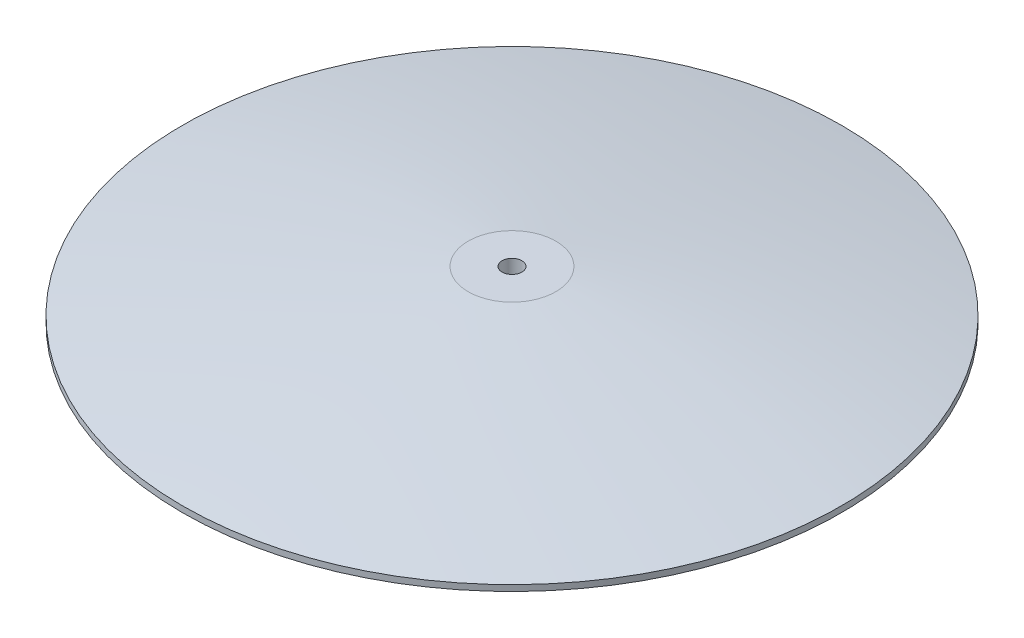
ISO-10303-21;
HEADER;
FILE_DESCRIPTION(('STEP AP214'),'2;1');
FILE_NAME('part.step','',(''),(''),'','','');
FILE_SCHEMA(('AUTOMOTIVE_DESIGN { 1 0 10303 214 1 1 1 1 }'));
ENDSEC;
DATA;
#1=APPLICATION_CONTEXT('core data for automotive mechanical design processes');
#2=APPLICATION_PROTOCOL_DEFINITION('international standard','automotive_design',2000,#1);
#3=PRODUCT_CONTEXT('',#1,'mechanical');
#4=PRODUCT('Part','Part','',(#3));
#5=PRODUCT_RELATED_PRODUCT_CATEGORY('part','',(#4));
#6=PRODUCT_DEFINITION_FORMATION('','',#4);
#7=PRODUCT_DEFINITION_CONTEXT('part definition',#1,'design');
#8=PRODUCT_DEFINITION('design','',#6,#7);
#9=PRODUCT_DEFINITION_SHAPE('','',#8);
#10=(LENGTH_UNIT() NAMED_UNIT(*) SI_UNIT(.MILLI.,.METRE.));
#11=(NAMED_UNIT(*) PLANE_ANGLE_UNIT() SI_UNIT($,.RADIAN.));
#12=(NAMED_UNIT(*) SI_UNIT($,.STERADIAN.) SOLID_ANGLE_UNIT());
#13=UNCERTAINTY_MEASURE_WITH_UNIT(LENGTH_MEASURE(1.E-05),#10,'distance_accuracy_value','');
#14=(GEOMETRIC_REPRESENTATION_CONTEXT(3) GLOBAL_UNCERTAINTY_ASSIGNED_CONTEXT((#13)) GLOBAL_UNIT_ASSIGNED_CONTEXT((#10,
#11,#12)) REPRESENTATION_CONTEXT('',''));
#15=CARTESIAN_POINT('',(0.,0.,0.));
#16=DIRECTION('',(0.,0.,1.));
#17=DIRECTION('',(1.,0.,0.));
#18=AXIS2_PLACEMENT_3D('',#15,#16,#17);
#19=CARTESIAN_POINT('',(0.,8.72974590863113,0.));
#20=DIRECTION('',(0.,1.,0.));
#21=DIRECTION('',(0.,0.,1.));
#22=AXIS2_PLACEMENT_3D('',#19,#20,#21);
#23=CYLINDRICAL_SURFACE('',#22,55.);
#24=CARTESIAN_POINT('',(0.,1.,0.));
#25=DIRECTION('',(0.,1.,0.));
#26=DIRECTION('',(0.,0.,1.));
#27=AXIS2_PLACEMENT_3D('',#24,#25,#26);
#28=CIRCLE('',#27,55.);
#29=CARTESIAN_POINT('',(0.,1.,55.));
#30=VERTEX_POINT('',#29);
#31=EDGE_CURVE('E10',#30,#30,#28,.T.);
#32=ORIENTED_EDGE('',*,*,#31,.F.);
#33=EDGE_LOOP('',(#32));
#34=FACE_BOUND('',#33,.T.);
#35=CARTESIAN_POINT('',(0.,0.,0.));
#36=DIRECTION('',(0.,1.,0.));
#37=DIRECTION('',(0.,0.,1.));
#38=AXIS2_PLACEMENT_3D('',#35,#36,#37);
#39=CIRCLE('',#38,55.);
#40=CARTESIAN_POINT('',(0.,0.,55.));
#41=VERTEX_POINT('',#40);
#42=EDGE_CURVE('E48',#41,#41,#39,.T.);
#43=ORIENTED_EDGE('',*,*,#42,.T.);
#44=EDGE_LOOP('',(#43));
#45=FACE_BOUND('',#44,.T.);
#46=ADVANCED_FACE('F37',(#34,#45),#23,.T.);
#47=CARTESIAN_POINT('',(55.,1.,0.));
#48=CARTESIAN_POINT('',(27.73593714875,6.57554990366532,0.));
#49=CARTESIAN_POINT('',(0.,8.72974590863113,0.));
#50=B_SPLINE_CURVE_WITH_KNOTS('',2,(#47,#48,#49),.UNSPECIFIED.,.F.,.F.,(3,3),(0.,1.),.UNSPECIFIED.);
#51=CARTESIAN_POINT('',(0.,8.72974590863113,0.));
#52=DIRECTION('',(0.,1.,0.));
#53=AXIS1_PLACEMENT('',#51,#52);
#54=SURFACE_OF_REVOLUTION('',#50,#53);
#55=CARTESIAN_POINT('',(0.,8.10142441729091,0.));
#56=DIRECTION('',(0.,1.,0.));
#57=DIRECTION('',(0.,0.,1.));
#58=AXIS2_PLACEMENT_3D('',#55,#56,#57);
#59=CIRCLE('',#58,7.31406627342336);
#60=CARTESIAN_POINT('',(0.,8.10142441729091,7.31406627342336));
#61=VERTEX_POINT('',#60);
#62=EDGE_CURVE('E44',#61,#61,#59,.T.);
#63=ORIENTED_EDGE('',*,*,#62,.F.);
#64=EDGE_LOOP('',(#63));
#65=FACE_BOUND('',#64,.T.);
#66=ORIENTED_EDGE('',*,*,#31,.T.);
#67=EDGE_LOOP('',(#66));
#68=FACE_BOUND('',#67,.T.);
#69=ADVANCED_FACE('F73',(#65,#68),#54,.T.);
#70=CARTESIAN_POINT('',(0.,8.10142441729091,0.));
#71=DIRECTION('',(0.,1.,0.));
#72=DIRECTION('',(0.,0.,1.));
#73=AXIS2_PLACEMENT_3D('',#70,#71,#72);
#74=PLANE('',#73);
#75=CARTESIAN_POINT('',(0.,8.10142441729091,0.));
#76=DIRECTION('',(0.,1.,0.));
#77=DIRECTION('',(0.,0.,1.));
#78=AXIS2_PLACEMENT_3D('',#75,#76,#77);
#79=CIRCLE('',#78,1.65);
#80=CARTESIAN_POINT('',(0.,8.10142441729091,1.65));
#81=VERTEX_POINT('',#80);
#82=EDGE_CURVE('E131',#81,#81,#79,.T.);
#83=ORIENTED_EDGE('',*,*,#82,.F.);
#84=EDGE_LOOP('',(#83));
#85=FACE_BOUND('',#84,.T.);
#86=ORIENTED_EDGE('',*,*,#62,.T.);
#87=EDGE_LOOP('',(#86));
#88=FACE_BOUND('',#87,.T.);
#89=ADVANCED_FACE('F70',(#85,#88),#74,.T.);
#90=CARTESIAN_POINT('',(55.,0.,0.));
#91=CARTESIAN_POINT('',(27.6851980588974,4.68161457970813,0.));
#92=CARTESIAN_POINT('',(0.,5.22974590863114,0.));
#93=B_SPLINE_CURVE_WITH_KNOTS('',2,(#90,#91,#92),.UNSPECIFIED.,.F.,.F.,(3,3),(0.,1.),.UNSPECIFIED.);
#94=CARTESIAN_POINT('',(0.,8.72974590863113,0.));
#95=DIRECTION('',(0.,1.,0.));
#96=AXIS1_PLACEMENT('',#94,#95);
#97=SURFACE_OF_REVOLUTION('',#93,#96);
#98=CARTESIAN_POINT('',(0.,5.19339952091498,0.));
#99=DIRECTION('',(0.,1.,0.));
#100=DIRECTION('',(0.,0.,1.));
#101=AXIS2_PLACEMENT_3D('',#98,#99,#100);
#102=CIRCLE('',#101,1.65000000000009);
#103=CARTESIAN_POINT('',(0.,5.19339952091498,1.65000000000009));
#104=VERTEX_POINT('',#103);
#105=EDGE_CURVE('E40',#104,#104,#102,.F.);
#106=ORIENTED_EDGE('',*,*,#105,.F.);
#107=EDGE_LOOP('',(#106));
#108=FACE_BOUND('',#107,.T.);
#109=ORIENTED_EDGE('',*,*,#42,.F.);
#110=EDGE_LOOP('',(#109));
#111=FACE_BOUND('',#110,.T.);
#112=ADVANCED_FACE('F65',(#108,#111),#97,.F.);
#113=CARTESIAN_POINT('',(0.,-1.89857558270909,0.));
#114=DIRECTION('',(0.,1.,0.));
#115=DIRECTION('',(0.,0.,1.));
#116=AXIS2_PLACEMENT_3D('',#113,#114,#115);
#117=CYLINDRICAL_SURFACE('',#116,1.65);
#118=ORIENTED_EDGE('',*,*,#105,.T.);
#119=EDGE_LOOP('',(#118));
#120=FACE_BOUND('',#119,.T.);
#121=ORIENTED_EDGE('',*,*,#82,.T.);
#122=EDGE_LOOP('',(#121));
#123=FACE_BOUND('',#122,.T.);
#124=ADVANCED_FACE('F69',(#120,#123),#117,.F.);
#125=CLOSED_SHELL('',(#46,#69,#89,#112,#124));
#126=MANIFOLD_SOLID_BREP('B2',#125);
#127=ADVANCED_BREP_SHAPE_REPRESENTATION('',(#18,#126),#14);
#128=SHAPE_DEFINITION_REPRESENTATION(#9,#127);
ENDSEC;
END-ISO-10303-21;
